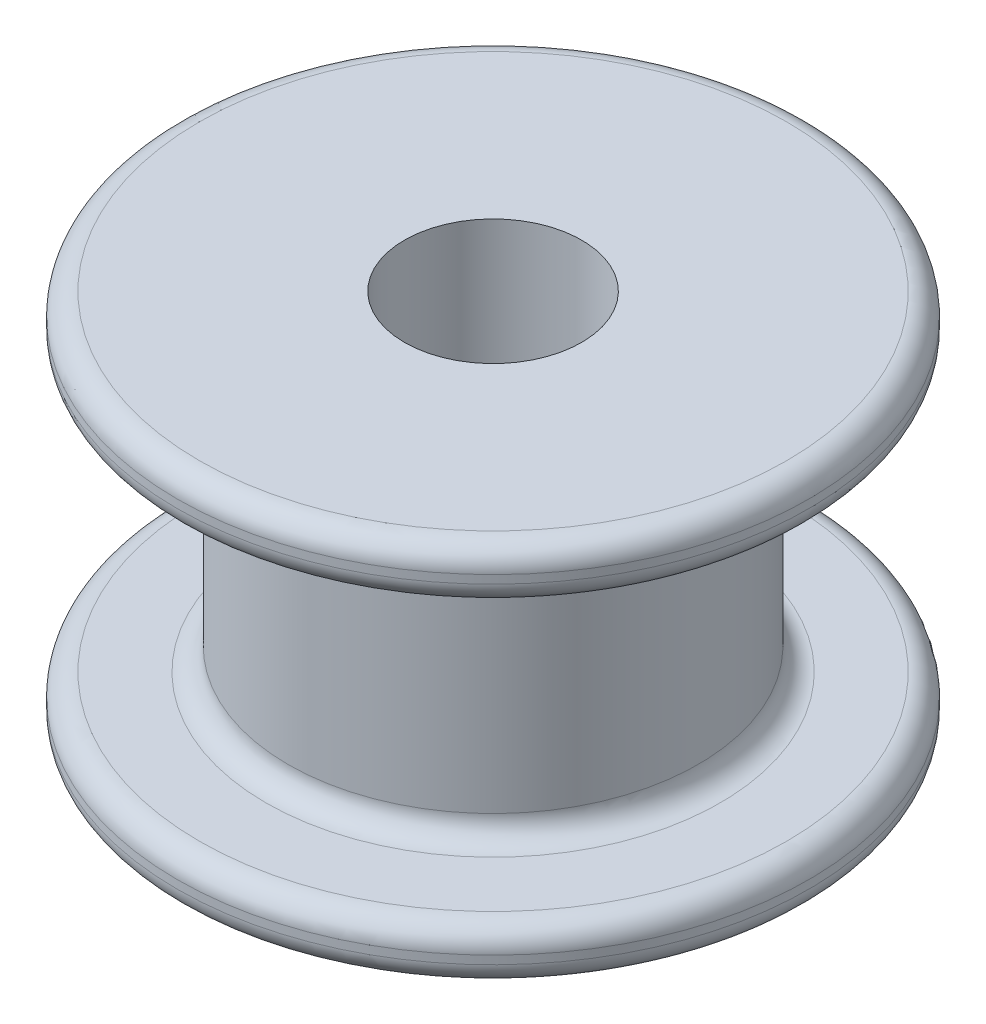
ISO-10303-21;
HEADER;
FILE_DESCRIPTION(('STEP AP214'),'2;1');
FILE_NAME('part.step','',(''),(''),'','','');
FILE_SCHEMA(('AUTOMOTIVE_DESIGN { 1 0 10303 214 1 1 1 1 }'));
ENDSEC;
DATA;
#1=APPLICATION_CONTEXT('core data for automotive mechanical design processes');
#2=APPLICATION_PROTOCOL_DEFINITION('international standard','automotive_design',2000,#1);
#3=PRODUCT_CONTEXT('',#1,'mechanical');
#4=PRODUCT('Part','Part','',(#3));
#5=PRODUCT_RELATED_PRODUCT_CATEGORY('part','',(#4));
#6=PRODUCT_DEFINITION_FORMATION('','',#4);
#7=PRODUCT_DEFINITION_CONTEXT('part definition',#1,'design');
#8=PRODUCT_DEFINITION('design','',#6,#7);
#9=PRODUCT_DEFINITION_SHAPE('','',#8);
#10=(LENGTH_UNIT() NAMED_UNIT(*) SI_UNIT(.MILLI.,.METRE.));
#11=(NAMED_UNIT(*) PLANE_ANGLE_UNIT() SI_UNIT($,.RADIAN.));
#12=(NAMED_UNIT(*) SI_UNIT($,.STERADIAN.) SOLID_ANGLE_UNIT());
#13=UNCERTAINTY_MEASURE_WITH_UNIT(LENGTH_MEASURE(1.E-05),#10,'distance_accuracy_value','');
#14=(GEOMETRIC_REPRESENTATION_CONTEXT(3) GLOBAL_UNCERTAINTY_ASSIGNED_CONTEXT((#13)) GLOBAL_UNIT_ASSIGNED_CONTEXT((#10,
#11,#12)) REPRESENTATION_CONTEXT('',''));
#15=CARTESIAN_POINT('',(0.,0.,0.));
#16=DIRECTION('',(0.,0.,1.));
#17=DIRECTION('',(1.,0.,0.));
#18=AXIS2_PLACEMENT_3D('',#15,#16,#17);
#19=CARTESIAN_POINT('',(0.,18.1125,0.));
#20=DIRECTION('',(0.,1.,0.));
#21=DIRECTION('',(0.,0.,1.));
#22=AXIS2_PLACEMENT_3D('',#19,#20,#21);
#23=CYLINDRICAL_SURFACE('',#22,18.5);
#24=CARTESIAN_POINT('',(0.,10.5,0.));
#25=DIRECTION('',(0.,1.,0.));
#26=DIRECTION('',(0.,0.,1.));
#27=AXIS2_PLACEMENT_3D('',#24,#25,#26);
#28=CIRCLE('',#27,18.5);
#29=CARTESIAN_POINT('',(0.,10.5,18.5));
#30=VERTEX_POINT('',#29);
#31=EDGE_CURVE('E10',#30,#30,#28,.T.);
#32=ORIENTED_EDGE('',*,*,#31,.F.);
#33=EDGE_LOOP('',(#32));
#34=FACE_BOUND('',#33,.T.);
#35=CARTESIAN_POINT('',(0.,-10.5,0.));
#36=DIRECTION('',(0.,1.,0.));
#37=DIRECTION('',(0.,0.,1.));
#38=AXIS2_PLACEMENT_3D('',#35,#36,#37);
#39=CIRCLE('',#38,18.5);
#40=CARTESIAN_POINT('',(0.,-10.5,18.5));
#41=VERTEX_POINT('',#40);
#42=EDGE_CURVE('E58',#41,#41,#39,.T.);
#43=ORIENTED_EDGE('',*,*,#42,.T.);
#44=EDGE_LOOP('',(#43));
#45=FACE_BOUND('',#44,.T.);
#46=ADVANCED_FACE('F30',(#34,#45),#23,.T.);
#47=CARTESIAN_POINT('',(0.,10.5,0.));
#48=DIRECTION('',(0.,1.,0.));
#49=DIRECTION('',(0.,0.,1.));
#50=AXIS2_PLACEMENT_3D('',#47,#48,#49);
#51=TOROIDAL_SURFACE('',#50,20.5,2.);
#52=CARTESIAN_POINT('',(0.,12.5,0.));
#53=DIRECTION('',(0.,1.,0.));
#54=DIRECTION('',(0.,0.,1.));
#55=AXIS2_PLACEMENT_3D('',#52,#53,#54);
#56=CIRCLE('',#55,20.5);
#57=CARTESIAN_POINT('',(0.,12.5,20.5));
#58=VERTEX_POINT('',#57);
#59=EDGE_CURVE('E36',#58,#58,#56,.T.);
#60=ORIENTED_EDGE('',*,*,#59,.F.);
#61=EDGE_LOOP('',(#60));
#62=FACE_BOUND('',#61,.T.);
#63=ORIENTED_EDGE('',*,*,#31,.T.);
#64=EDGE_LOOP('',(#63));
#65=FACE_BOUND('',#64,.T.);
#66=ADVANCED_FACE('F100',(#62,#65),#51,.F.);
#67=CARTESIAN_POINT('',(0.,12.5,-26.5));
#68=DIRECTION('',(0.,1.,0.));
#69=DIRECTION('',(0.,0.,1.));
#70=AXIS2_PLACEMENT_3D('',#67,#68,#69);
#71=PLANE('',#70);
#72=CARTESIAN_POINT('',(0.,12.5,0.));
#73=DIRECTION('',(0.,1.,0.));
#74=DIRECTION('',(0.,0.,1.));
#75=AXIS2_PLACEMENT_3D('',#72,#73,#74);
#76=CIRCLE('',#75,26.5);
#77=CARTESIAN_POINT('',(0.,12.5,26.5));
#78=VERTEX_POINT('',#77);
#79=EDGE_CURVE('E40',#78,#78,#76,.T.);
#80=ORIENTED_EDGE('',*,*,#79,.F.);
#81=EDGE_LOOP('',(#80));
#82=FACE_BOUND('',#81,.T.);
#83=ORIENTED_EDGE('',*,*,#59,.T.);
#84=EDGE_LOOP('',(#83));
#85=FACE_BOUND('',#84,.T.);
#86=ADVANCED_FACE('F105',(#82,#85),#71,.F.);
#87=CARTESIAN_POINT('',(0.,14.5,0.));
#88=DIRECTION('',(0.,1.,0.));
#89=DIRECTION('',(0.,0.,1.));
#90=AXIS2_PLACEMENT_3D('',#87,#88,#89);
#91=TOROIDAL_SURFACE('',#90,26.5,2.);
#92=CARTESIAN_POINT('',(0.,14.5,0.));
#93=DIRECTION('',(0.,1.,0.));
#94=DIRECTION('',(0.,0.,1.));
#95=AXIS2_PLACEMENT_3D('',#92,#93,#94);
#96=CIRCLE('',#95,28.5);
#97=CARTESIAN_POINT('',(0.,14.5,28.5));
#98=VERTEX_POINT('',#97);
#99=EDGE_CURVE('E44',#98,#98,#96,.T.);
#100=ORIENTED_EDGE('',*,*,#99,.F.);
#101=EDGE_LOOP('',(#100));
#102=FACE_BOUND('',#101,.T.);
#103=ORIENTED_EDGE('',*,*,#79,.T.);
#104=EDGE_LOOP('',(#103));
#105=FACE_BOUND('',#104,.T.);
#106=ADVANCED_FACE('F113',(#102,#105),#91,.T.);
#107=CARTESIAN_POINT('',(0.,18.1125,0.));
#108=DIRECTION('',(0.,1.,0.));
#109=DIRECTION('',(0.,0.,1.));
#110=AXIS2_PLACEMENT_3D('',#107,#108,#109);
#111=CYLINDRICAL_SURFACE('',#110,28.5);
#112=CARTESIAN_POINT('',(0.,15.25,0.));
#113=DIRECTION('',(0.,1.,0.));
#114=DIRECTION('',(0.,0.,1.));
#115=AXIS2_PLACEMENT_3D('',#112,#113,#114);
#116=CIRCLE('',#115,28.5);
#117=CARTESIAN_POINT('',(0.,15.25,28.5));
#118=VERTEX_POINT('',#117);
#119=EDGE_CURVE('E49',#118,#118,#116,.T.);
#120=ORIENTED_EDGE('',*,*,#119,.F.);
#121=EDGE_LOOP('',(#120));
#122=FACE_BOUND('',#121,.T.);
#123=ORIENTED_EDGE('',*,*,#99,.T.);
#124=EDGE_LOOP('',(#123));
#125=FACE_BOUND('',#124,.T.);
#126=ADVANCED_FACE('F119',(#122,#125),#111,.T.);
#127=CARTESIAN_POINT('',(0.,15.25,0.));
#128=DIRECTION('',(0.,1.,0.));
#129=DIRECTION('',(0.,0.,1.));
#130=AXIS2_PLACEMENT_3D('',#127,#128,#129);
#131=TOROIDAL_SURFACE('',#130,26.5,2.);
#132=CARTESIAN_POINT('',(0.,17.25,0.));
#133=DIRECTION('',(0.,1.,0.));
#134=DIRECTION('',(0.,0.,1.));
#135=AXIS2_PLACEMENT_3D('',#132,#133,#134);
#136=CIRCLE('',#135,26.5);
#137=CARTESIAN_POINT('',(0.,17.25,26.5));
#138=VERTEX_POINT('',#137);
#139=EDGE_CURVE('E52',#138,#138,#136,.T.);
#140=ORIENTED_EDGE('',*,*,#139,.F.);
#141=EDGE_LOOP('',(#140));
#142=FACE_BOUND('',#141,.T.);
#143=ORIENTED_EDGE('',*,*,#119,.T.);
#144=EDGE_LOOP('',(#143));
#145=FACE_BOUND('',#144,.T.);
#146=ADVANCED_FACE('F96',(#142,#145),#131,.T.);
#147=CARTESIAN_POINT('',(0.,17.25,-8.));
#148=DIRECTION('',(0.,-1.,0.));
#149=DIRECTION('',(0.,0.,-1.));
#150=AXIS2_PLACEMENT_3D('',#147,#148,#149);
#151=PLANE('',#150);
#152=CARTESIAN_POINT('',(0.,17.25,0.));
#153=DIRECTION('',(0.,1.,0.));
#154=DIRECTION('',(0.,0.,1.));
#155=AXIS2_PLACEMENT_3D('',#152,#153,#154);
#156=CIRCLE('',#155,8.);
#157=CARTESIAN_POINT('',(0.,17.25,8.));
#158=VERTEX_POINT('',#157);
#159=EDGE_CURVE('E55',#158,#158,#156,.T.);
#160=ORIENTED_EDGE('',*,*,#159,.F.);
#161=EDGE_LOOP('',(#160));
#162=FACE_BOUND('',#161,.T.);
#163=ORIENTED_EDGE('',*,*,#139,.T.);
#164=EDGE_LOOP('',(#163));
#165=FACE_BOUND('',#164,.T.);
#166=ADVANCED_FACE('F86',(#162,#165),#151,.F.);
#167=CARTESIAN_POINT('',(0.,18.1125,0.));
#168=DIRECTION('',(0.,1.,0.));
#169=DIRECTION('',(0.,0.,1.));
#170=AXIS2_PLACEMENT_3D('',#167,#168,#169);
#171=CYLINDRICAL_SURFACE('',#170,8.);
#172=ORIENTED_EDGE('',*,*,#159,.T.);
#173=EDGE_LOOP('',(#172));
#174=FACE_BOUND('',#173,.T.);
#175=CARTESIAN_POINT('',(0.,-17.25,0.));
#176=DIRECTION('',(0.,1.,0.));
#177=DIRECTION('',(0.,0.,1.));
#178=AXIS2_PLACEMENT_3D('',#175,#176,#177);
#179=CIRCLE('',#178,8.);
#180=CARTESIAN_POINT('',(0.,-17.25,8.));
#181=VERTEX_POINT('',#180);
#182=EDGE_CURVE('E76',#181,#181,#179,.T.);
#183=ORIENTED_EDGE('',*,*,#182,.F.);
#184=EDGE_LOOP('',(#183));
#185=FACE_BOUND('',#184,.T.);
#186=ADVANCED_FACE('F83',(#174,#185),#171,.F.);
#187=CARTESIAN_POINT('',(0.,-10.5,0.));
#188=DIRECTION('',(0.,-1.,0.));
#189=DIRECTION('',(0.,0.,1.));
#190=AXIS2_PLACEMENT_3D('',#187,#188,#189);
#191=TOROIDAL_SURFACE('',#190,20.5,2.);
#192=CARTESIAN_POINT('',(0.,-12.5,0.));
#193=DIRECTION('',(0.,1.,0.));
#194=DIRECTION('',(0.,0.,1.));
#195=AXIS2_PLACEMENT_3D('',#192,#193,#194);
#196=CIRCLE('',#195,20.5);
#197=CARTESIAN_POINT('',(0.,-12.5,20.5));
#198=VERTEX_POINT('',#197);
#199=EDGE_CURVE('E61',#198,#198,#196,.T.);
#200=ORIENTED_EDGE('',*,*,#199,.T.);
#201=EDGE_LOOP('',(#200));
#202=FACE_BOUND('',#201,.T.);
#203=ORIENTED_EDGE('',*,*,#42,.F.);
#204=EDGE_LOOP('',(#203));
#205=FACE_BOUND('',#204,.T.);
#206=ADVANCED_FACE('F85',(#202,#205),#191,.F.);
#207=CARTESIAN_POINT('',(0.,-12.5,-26.5));
#208=DIRECTION('',(0.,-1.,0.));
#209=DIRECTION('',(0.,0.,1.));
#210=AXIS2_PLACEMENT_3D('',#207,#208,#209);
#211=PLANE('',#210);
#212=CARTESIAN_POINT('',(0.,-12.5,0.));
#213=DIRECTION('',(0.,1.,0.));
#214=DIRECTION('',(0.,0.,1.));
#215=AXIS2_PLACEMENT_3D('',#212,#213,#214);
#216=CIRCLE('',#215,26.5);
#217=CARTESIAN_POINT('',(0.,-12.5,26.5));
#218=VERTEX_POINT('',#217);
#219=EDGE_CURVE('E64',#218,#218,#216,.T.);
#220=ORIENTED_EDGE('',*,*,#219,.T.);
#221=EDGE_LOOP('',(#220));
#222=FACE_BOUND('',#221,.T.);
#223=ORIENTED_EDGE('',*,*,#199,.F.);
#224=EDGE_LOOP('',(#223));
#225=FACE_BOUND('',#224,.T.);
#226=ADVANCED_FACE('F93',(#222,#225),#211,.F.);
#227=CARTESIAN_POINT('',(0.,-14.5,0.));
#228=DIRECTION('',(0.,-1.,0.));
#229=DIRECTION('',(0.,0.,1.));
#230=AXIS2_PLACEMENT_3D('',#227,#228,#229);
#231=TOROIDAL_SURFACE('',#230,26.5,2.);
#232=CARTESIAN_POINT('',(0.,-14.5,0.));
#233=DIRECTION('',(0.,1.,0.));
#234=DIRECTION('',(0.,0.,1.));
#235=AXIS2_PLACEMENT_3D('',#232,#233,#234);
#236=CIRCLE('',#235,28.5);
#237=CARTESIAN_POINT('',(0.,-14.5,28.5));
#238=VERTEX_POINT('',#237);
#239=EDGE_CURVE('E67',#238,#238,#236,.T.);
#240=ORIENTED_EDGE('',*,*,#239,.T.);
#241=EDGE_LOOP('',(#240));
#242=FACE_BOUND('',#241,.T.);
#243=ORIENTED_EDGE('',*,*,#219,.F.);
#244=EDGE_LOOP('',(#243));
#245=FACE_BOUND('',#244,.T.);
#246=ADVANCED_FACE('F167',(#242,#245),#231,.T.);
#247=CARTESIAN_POINT('',(0.,-18.1125,0.));
#248=DIRECTION('',(0.,-1.,0.));
#249=DIRECTION('',(0.,0.,1.));
#250=AXIS2_PLACEMENT_3D('',#247,#248,#249);
#251=CYLINDRICAL_SURFACE('',#250,28.5);
#252=CARTESIAN_POINT('',(0.,-15.25,0.));
#253=DIRECTION('',(0.,1.,0.));
#254=DIRECTION('',(0.,0.,1.));
#255=AXIS2_PLACEMENT_3D('',#252,#253,#254);
#256=CIRCLE('',#255,28.5);
#257=CARTESIAN_POINT('',(0.,-15.25,28.5));
#258=VERTEX_POINT('',#257);
#259=EDGE_CURVE('E70',#258,#258,#256,.T.);
#260=ORIENTED_EDGE('',*,*,#259,.T.);
#261=EDGE_LOOP('',(#260));
#262=FACE_BOUND('',#261,.T.);
#263=ORIENTED_EDGE('',*,*,#239,.F.);
#264=EDGE_LOOP('',(#263));
#265=FACE_BOUND('',#264,.T.);
#266=ADVANCED_FACE('F177',(#262,#265),#251,.T.);
#267=CARTESIAN_POINT('',(0.,-15.25,0.));
#268=DIRECTION('',(0.,-1.,0.));
#269=DIRECTION('',(0.,0.,1.));
#270=AXIS2_PLACEMENT_3D('',#267,#268,#269);
#271=TOROIDAL_SURFACE('',#270,26.5,2.);
#272=CARTESIAN_POINT('',(0.,-17.25,0.));
#273=DIRECTION('',(0.,1.,0.));
#274=DIRECTION('',(0.,0.,1.));
#275=AXIS2_PLACEMENT_3D('',#272,#273,#274);
#276=CIRCLE('',#275,26.5);
#277=CARTESIAN_POINT('',(0.,-17.25,26.5));
#278=VERTEX_POINT('',#277);
#279=EDGE_CURVE('E73',#278,#278,#276,.T.);
#280=ORIENTED_EDGE('',*,*,#279,.T.);
#281=EDGE_LOOP('',(#280));
#282=FACE_BOUND('',#281,.T.);
#283=ORIENTED_EDGE('',*,*,#259,.F.);
#284=EDGE_LOOP('',(#283));
#285=FACE_BOUND('',#284,.T.);
#286=ADVANCED_FACE('F187',(#282,#285),#271,.T.);
#287=CARTESIAN_POINT('',(0.,-17.25,-8.));
#288=DIRECTION('',(0.,1.,0.));
#289=DIRECTION('',(0.,0.,-1.));
#290=AXIS2_PLACEMENT_3D('',#287,#288,#289);
#291=PLANE('',#290);
#292=ORIENTED_EDGE('',*,*,#182,.T.);
#293=EDGE_LOOP('',(#292));
#294=FACE_BOUND('',#293,.T.);
#295=ORIENTED_EDGE('',*,*,#279,.F.);
#296=EDGE_LOOP('',(#295));
#297=FACE_BOUND('',#296,.T.);
#298=ADVANCED_FACE('F80',(#294,#297),#291,.F.);
#299=CLOSED_SHELL('',(#46,#66,#86,#106,#126,#146,#166,#186,#206,#226,#246,#266,#286,#298));
#300=MANIFOLD_SOLID_BREP('B2',#299);
#301=ADVANCED_BREP_SHAPE_REPRESENTATION('',(#18,#300),#14);
#302=SHAPE_DEFINITION_REPRESENTATION(#9,#301);
ENDSEC;
END-ISO-10303-21;
